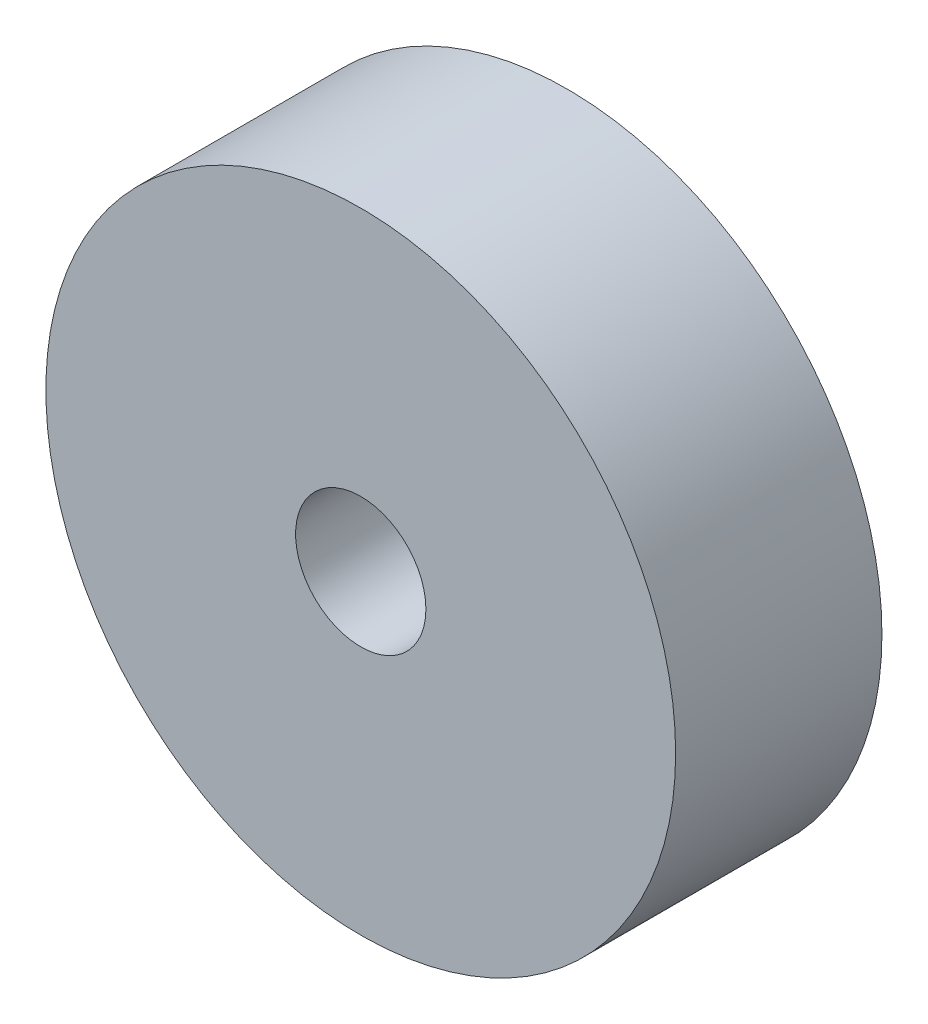
ISO-10303-21;
HEADER;
FILE_DESCRIPTION(('STEP AP214'),'2;1');
FILE_NAME('part.step','',(''),(''),'','','');
FILE_SCHEMA(('AUTOMOTIVE_DESIGN { 1 0 10303 214 1 1 1 1 }'));
ENDSEC;
DATA;
#1=APPLICATION_CONTEXT('core data for automotive mechanical design processes');
#2=APPLICATION_PROTOCOL_DEFINITION('international standard','automotive_design',2000,#1);
#3=PRODUCT_CONTEXT('',#1,'mechanical');
#4=PRODUCT('Part','Part','',(#3));
#5=PRODUCT_RELATED_PRODUCT_CATEGORY('part','',(#4));
#6=PRODUCT_DEFINITION_FORMATION('','',#4);
#7=PRODUCT_DEFINITION_CONTEXT('part definition',#1,'design');
#8=PRODUCT_DEFINITION('design','',#6,#7);
#9=PRODUCT_DEFINITION_SHAPE('','',#8);
#10=(LENGTH_UNIT() NAMED_UNIT(*) SI_UNIT(.MILLI.,.METRE.));
#11=(NAMED_UNIT(*) PLANE_ANGLE_UNIT() SI_UNIT($,.RADIAN.));
#12=(NAMED_UNIT(*) SI_UNIT($,.STERADIAN.) SOLID_ANGLE_UNIT());
#13=UNCERTAINTY_MEASURE_WITH_UNIT(LENGTH_MEASURE(1.E-05),#10,'distance_accuracy_value','');
#14=(GEOMETRIC_REPRESENTATION_CONTEXT(3) GLOBAL_UNCERTAINTY_ASSIGNED_CONTEXT((#13)) GLOBAL_UNIT_ASSIGNED_CONTEXT((#10,
#11,#12)) REPRESENTATION_CONTEXT('',''));
#15=CARTESIAN_POINT('',(0.,0.,0.));
#16=DIRECTION('',(0.,0.,1.));
#17=DIRECTION('',(1.,0.,0.));
#18=AXIS2_PLACEMENT_3D('',#15,#16,#17);
#19=CARTESIAN_POINT('',(0.,0.,19.));
#20=DIRECTION('',(0.,0.,-1.));
#21=DIRECTION('',(-1.,0.,0.));
#22=AXIS2_PLACEMENT_3D('',#19,#20,#21);
#23=CYLINDRICAL_SURFACE('',#22,29.);
#24=CARTESIAN_POINT('',(0.,0.,19.));
#25=DIRECTION('',(0.,0.,1.));
#26=DIRECTION('',(1.,0.,0.));
#27=AXIS2_PLACEMENT_3D('',#24,#25,#26);
#28=CIRCLE('',#27,29.);
#29=CARTESIAN_POINT('',(29.,0.,19.));
#30=VERTEX_POINT('',#29);
#31=EDGE_CURVE('E10',#30,#30,#28,.T.);
#32=ORIENTED_EDGE('',*,*,#31,.F.);
#33=EDGE_LOOP('',(#32));
#34=FACE_BOUND('',#33,.T.);
#35=CARTESIAN_POINT('',(0.,0.,0.));
#36=DIRECTION('',(0.,0.,1.));
#37=DIRECTION('',(1.,0.,0.));
#38=AXIS2_PLACEMENT_3D('',#35,#36,#37);
#39=CIRCLE('',#38,29.);
#40=CARTESIAN_POINT('',(29.,0.,0.));
#41=VERTEX_POINT('',#40);
#42=EDGE_CURVE('E36',#41,#41,#39,.T.);
#43=ORIENTED_EDGE('',*,*,#42,.T.);
#44=EDGE_LOOP('',(#43));
#45=FACE_BOUND('',#44,.T.);
#46=ADVANCED_FACE('F33',(#34,#45),#23,.T.);
#47=CARTESIAN_POINT('',(0.,0.,19.));
#48=DIRECTION('',(0.,0.,1.));
#49=DIRECTION('',(1.,0.,0.));
#50=AXIS2_PLACEMENT_3D('',#47,#48,#49);
#51=PLANE('',#50);
#52=CARTESIAN_POINT('',(0.,0.,19.));
#53=DIRECTION('',(0.,0.,1.));
#54=DIRECTION('',(1.,0.,0.));
#55=AXIS2_PLACEMENT_3D('',#52,#53,#54);
#56=CIRCLE('',#55,6.);
#57=CARTESIAN_POINT('',(6.,0.,19.));
#58=VERTEX_POINT('',#57);
#59=EDGE_CURVE('E45',#58,#58,#56,.T.);
#60=ORIENTED_EDGE('',*,*,#59,.F.);
#61=EDGE_LOOP('',(#60));
#62=FACE_BOUND('',#61,.T.);
#63=ORIENTED_EDGE('',*,*,#31,.T.);
#64=EDGE_LOOP('',(#63));
#65=FACE_BOUND('',#64,.T.);
#66=ADVANCED_FACE('F60',(#62,#65),#51,.T.);
#67=CARTESIAN_POINT('',(0.,0.,0.));
#68=DIRECTION('',(0.,0.,1.));
#69=DIRECTION('',(1.,0.,0.));
#70=AXIS2_PLACEMENT_3D('',#67,#68,#69);
#71=PLANE('',#70);
#72=CARTESIAN_POINT('',(0.,0.,0.));
#73=DIRECTION('',(0.,0.,1.));
#74=DIRECTION('',(1.,0.,0.));
#75=AXIS2_PLACEMENT_3D('',#72,#73,#74);
#76=CIRCLE('',#75,6.);
#77=CARTESIAN_POINT('',(6.,0.,0.));
#78=VERTEX_POINT('',#77);
#79=EDGE_CURVE('E43',#78,#78,#76,.T.);
#80=ORIENTED_EDGE('',*,*,#79,.T.);
#81=EDGE_LOOP('',(#80));
#82=FACE_BOUND('',#81,.T.);
#83=ORIENTED_EDGE('',*,*,#42,.F.);
#84=EDGE_LOOP('',(#83));
#85=FACE_BOUND('',#84,.T.);
#86=ADVANCED_FACE('F51',(#82,#85),#71,.F.);
#87=CARTESIAN_POINT('',(0.,0.,0.));
#88=DIRECTION('',(0.,0.,1.));
#89=DIRECTION('',(1.,0.,0.));
#90=AXIS2_PLACEMENT_3D('',#87,#88,#89);
#91=CYLINDRICAL_SURFACE('',#90,6.);
#92=ORIENTED_EDGE('',*,*,#79,.F.);
#93=EDGE_LOOP('',(#92));
#94=FACE_BOUND('',#93,.T.);
#95=ORIENTED_EDGE('',*,*,#59,.T.);
#96=EDGE_LOOP('',(#95));
#97=FACE_BOUND('',#96,.T.);
#98=ADVANCED_FACE('F54',(#94,#97),#91,.F.);
#99=CLOSED_SHELL('',(#46,#66,#86,#98));
#100=MANIFOLD_SOLID_BREP('B2',#99);
#101=ADVANCED_BREP_SHAPE_REPRESENTATION('',(#18,#100),#14);
#102=SHAPE_DEFINITION_REPRESENTATION(#9,#101);
ENDSEC;
END-ISO-10303-21;
